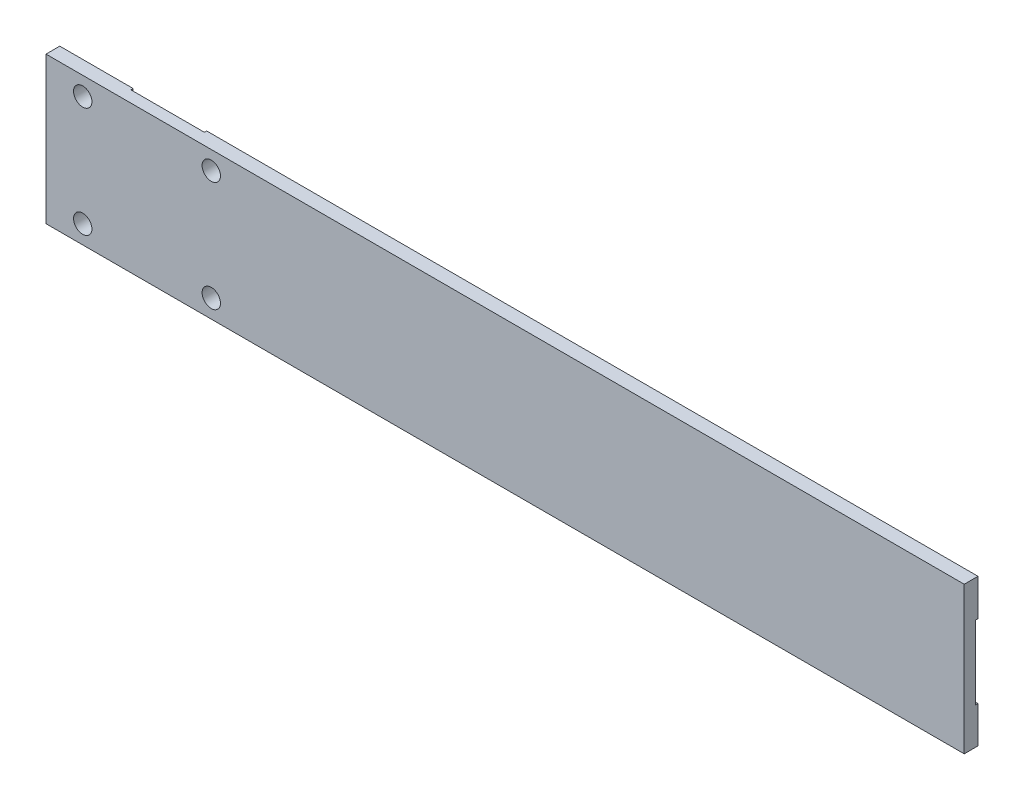
ISO-10303-21;
HEADER;
FILE_DESCRIPTION(('STEP AP214'),'2;1');
FILE_NAME('part.step','',(''),(''),'','','');
FILE_SCHEMA(('AUTOMOTIVE_DESIGN { 1 0 10303 214 1 1 1 1 }'));
ENDSEC;
DATA;
#1=APPLICATION_CONTEXT('core data for automotive mechanical design processes');
#2=APPLICATION_PROTOCOL_DEFINITION('international standard','automotive_design',2000,#1);
#3=PRODUCT_CONTEXT('',#1,'mechanical');
#4=PRODUCT('Part','Part','',(#3));
#5=PRODUCT_RELATED_PRODUCT_CATEGORY('part','',(#4));
#6=PRODUCT_DEFINITION_FORMATION('','',#4);
#7=PRODUCT_DEFINITION_CONTEXT('part definition',#1,'design');
#8=PRODUCT_DEFINITION('design','',#6,#7);
#9=PRODUCT_DEFINITION_SHAPE('','',#8);
#10=(LENGTH_UNIT() NAMED_UNIT(*) SI_UNIT(.MILLI.,.METRE.));
#11=(NAMED_UNIT(*) PLANE_ANGLE_UNIT() SI_UNIT($,.RADIAN.));
#12=(NAMED_UNIT(*) SI_UNIT($,.STERADIAN.) SOLID_ANGLE_UNIT());
#13=UNCERTAINTY_MEASURE_WITH_UNIT(LENGTH_MEASURE(1.E-05),#10,'distance_accuracy_value','');
#14=(GEOMETRIC_REPRESENTATION_CONTEXT(3) GLOBAL_UNCERTAINTY_ASSIGNED_CONTEXT((#13)) GLOBAL_UNIT_ASSIGNED_CONTEXT((#10,
#11,#12)) REPRESENTATION_CONTEXT('',''));
#15=CARTESIAN_POINT('',(0.,0.,0.));
#16=DIRECTION('',(0.,0.,1.));
#17=DIRECTION('',(1.,0.,0.));
#18=AXIS2_PLACEMENT_3D('',#15,#16,#17);
#19=CARTESIAN_POINT('',(0.,0.,0.));
#20=DIRECTION('',(0.,0.,-1.));
#21=DIRECTION('',(-1.,0.,0.));
#22=AXIS2_PLACEMENT_3D('',#19,#20,#21);
#23=PLANE('',#22);
#24=DIRECTION('',(0.,-1.,0.));
#25=VECTOR('',#24,1.);
#26=CARTESIAN_POINT('',(101.6,101.6,0.));
#27=LINE('',#26,#25);
#28=CARTESIAN_POINT('',(101.6,25.4,0.));
#29=VERTEX_POINT('',#28);
#30=CARTESIAN_POINT('',(101.6,0.,0.));
#31=VERTEX_POINT('',#30);
#32=EDGE_CURVE('E137',#29,#31,#27,.T.);
#33=ORIENTED_EDGE('',*,*,#32,.F.);
#34=DIRECTION('',(-1.,0.,0.));
#35=VECTOR('',#34,1.);
#36=CARTESIAN_POINT('',(635.,25.4,0.));
#37=LINE('',#36,#35);
#38=CARTESIAN_POINT('',(635.,25.4,0.));
#39=VERTEX_POINT('',#38);
#40=EDGE_CURVE('E237',#39,#29,#37,.T.);
#41=ORIENTED_EDGE('',*,*,#40,.F.);
#42=DIRECTION('',(0.,1.,0.));
#43=VECTOR('',#42,1.);
#44=CARTESIAN_POINT('',(635.,0.,0.));
#45=LINE('',#44,#43);
#46=CARTESIAN_POINT('',(635.,0.,0.));
#47=VERTEX_POINT('',#46);
#48=EDGE_CURVE('E160',#47,#39,#45,.T.);
#49=ORIENTED_EDGE('',*,*,#48,.F.);
#50=DIRECTION('',(1.,0.,0.));
#51=VECTOR('',#50,1.);
#52=CARTESIAN_POINT('',(0.,0.,0.));
#53=LINE('',#52,#51);
#54=EDGE_CURVE('E150',#31,#47,#53,.T.);
#55=ORIENTED_EDGE('',*,*,#54,.F.);
#56=EDGE_LOOP('',(#33,#41,#49,#55));
#57=FACE_BOUND('',#56,.T.);
#58=CARTESIAN_POINT('',(114.3,12.7,0.));
#59=DIRECTION('',(0.,0.,-1.));
#60=DIRECTION('',(1.,0.,0.));
#61=AXIS2_PLACEMENT_3D('',#58,#59,#60);
#62=CIRCLE('',#61,6.35);
#63=CARTESIAN_POINT('',(107.95,12.7,0.));
#64=VERTEX_POINT('',#63);
#65=EDGE_CURVE('E215',#64,#64,#62,.T.);
#66=ORIENTED_EDGE('',*,*,#65,.F.);
#67=EDGE_LOOP('',(#66));
#68=FACE_BOUND('',#67,.T.);
#69=ADVANCED_FACE('F38',(#57,#68),#23,.T.);
#70=CARTESIAN_POINT('',(101.6,101.6,0.));
#71=VERTEX_POINT('',#70);
#72=CARTESIAN_POINT('',(101.6,76.2,0.));
#73=VERTEX_POINT('',#72);
#74=EDGE_CURVE('E147',#71,#73,#27,.T.);
#75=ORIENTED_EDGE('',*,*,#74,.F.);
#76=DIRECTION('',(-1.,0.,0.));
#77=VECTOR('',#76,1.);
#78=CARTESIAN_POINT('',(0.,101.6,0.));
#79=LINE('',#78,#77);
#80=CARTESIAN_POINT('',(635.,101.6,0.));
#81=VERTEX_POINT('',#80);
#82=EDGE_CURVE('E172',#81,#71,#79,.T.);
#83=ORIENTED_EDGE('',*,*,#82,.F.);
#84=CARTESIAN_POINT('',(635.,76.2,0.));
#85=VERTEX_POINT('',#84);
#86=EDGE_CURVE('E165',#85,#81,#45,.T.);
#87=ORIENTED_EDGE('',*,*,#86,.F.);
#88=DIRECTION('',(-1.,0.,0.));
#89=VECTOR('',#88,1.);
#90=CARTESIAN_POINT('',(635.,76.2,0.));
#91=LINE('',#90,#89);
#92=EDGE_CURVE('E167',#85,#73,#91,.T.);
#93=ORIENTED_EDGE('',*,*,#92,.T.);
#94=EDGE_LOOP('',(#75,#83,#87,#93));
#95=FACE_BOUND('',#94,.T.);
#96=CARTESIAN_POINT('',(114.3,88.9,0.));
#97=DIRECTION('',(0.,0.,-1.));
#98=DIRECTION('',(-1.,0.,0.));
#99=AXIS2_PLACEMENT_3D('',#96,#97,#98);
#100=CIRCLE('',#99,6.34999999999999);
#101=CARTESIAN_POINT('',(107.95,88.9,0.));
#102=VERTEX_POINT('',#101);
#103=EDGE_CURVE('E208',#102,#102,#100,.T.);
#104=ORIENTED_EDGE('',*,*,#103,.F.);
#105=EDGE_LOOP('',(#104));
#106=FACE_BOUND('',#105,.T.);
#107=ADVANCED_FACE('F272',(#95,#106),#23,.T.);
#108=CARTESIAN_POINT('',(635.,0.,9.525));
#109=DIRECTION('',(-1.,0.,0.));
#110=DIRECTION('',(0.,0.,1.));
#111=AXIS2_PLACEMENT_3D('',#108,#109,#110);
#112=PLANE('',#111);
#113=DIRECTION('',(0.,0.,1.));
#114=VECTOR('',#113,1.);
#115=CARTESIAN_POINT('',(635.,76.2,0.));
#116=LINE('',#115,#114);
#117=CARTESIAN_POINT('',(635.,76.2,1.5875));
#118=VERTEX_POINT('',#117);
#119=EDGE_CURVE('E231',#85,#118,#116,.T.);
#120=ORIENTED_EDGE('',*,*,#119,.F.);
#121=ORIENTED_EDGE('',*,*,#86,.T.);
#122=DIRECTION('',(0.,0.,-1.));
#123=VECTOR('',#122,1.);
#124=CARTESIAN_POINT('',(635.,101.6,9.525));
#125=LINE('',#124,#123);
#126=CARTESIAN_POINT('',(635.,101.6,9.525));
#127=VERTEX_POINT('',#126);
#128=EDGE_CURVE('E178',#127,#81,#125,.T.);
#129=ORIENTED_EDGE('',*,*,#128,.F.);
#130=DIRECTION('',(0.,1.,0.));
#131=VECTOR('',#130,1.);
#132=CARTESIAN_POINT('',(635.,0.,9.525));
#133=LINE('',#132,#131);
#134=CARTESIAN_POINT('',(635.,0.,9.525));
#135=VERTEX_POINT('',#134);
#136=EDGE_CURVE('E249',#135,#127,#133,.T.);
#137=ORIENTED_EDGE('',*,*,#136,.F.);
#138=DIRECTION('',(0.,0.,-1.));
#139=VECTOR('',#138,1.);
#140=CARTESIAN_POINT('',(635.,0.,9.525));
#141=LINE('',#140,#139);
#142=EDGE_CURVE('E181',#135,#47,#141,.T.);
#143=ORIENTED_EDGE('',*,*,#142,.T.);
#144=ORIENTED_EDGE('',*,*,#48,.T.);
#145=DIRECTION('',(0.,0.,-1.));
#146=VECTOR('',#145,1.);
#147=CARTESIAN_POINT('',(635.,25.4,0.));
#148=LINE('',#147,#146);
#149=CARTESIAN_POINT('',(635.,25.4,1.58749999999999));
#150=VERTEX_POINT('',#149);
#151=EDGE_CURVE('E235',#150,#39,#148,.T.);
#152=ORIENTED_EDGE('',*,*,#151,.F.);
#153=DIRECTION('',(0.,-1.,0.));
#154=VECTOR('',#153,1.);
#155=CARTESIAN_POINT('',(635.,76.2,1.5875));
#156=LINE('',#155,#154);
#157=EDGE_CURVE('E233',#118,#150,#156,.T.);
#158=ORIENTED_EDGE('',*,*,#157,.F.);
#159=EDGE_LOOP('',(#120,#121,#129,#137,#143,#144,#152,#158));
#160=FACE_BOUND('',#159,.T.);
#161=ADVANCED_FACE('F255',(#160),#112,.F.);
#162=DIRECTION('',(0.,1.,0.));
#163=VECTOR('',#162,1.);
#164=CARTESIAN_POINT('',(50.8,76.2,0.));
#165=LINE('',#164,#163);
#166=CARTESIAN_POINT('',(50.8,0.,0.));
#167=VERTEX_POINT('',#166);
#168=CARTESIAN_POINT('',(50.8,101.6,0.));
#169=VERTEX_POINT('',#168);
#170=EDGE_CURVE('E189',#167,#169,#165,.T.);
#171=ORIENTED_EDGE('',*,*,#170,.F.);
#172=CARTESIAN_POINT('',(0.,0.,0.));
#173=VERTEX_POINT('',#172);
#174=EDGE_CURVE('E161',#173,#167,#53,.T.);
#175=ORIENTED_EDGE('',*,*,#174,.F.);
#176=DIRECTION('',(0.,-1.,0.));
#177=VECTOR('',#176,1.);
#178=CARTESIAN_POINT('',(0.,0.,0.));
#179=LINE('',#178,#177);
#180=CARTESIAN_POINT('',(0.,101.6,0.));
#181=VERTEX_POINT('',#180);
#182=EDGE_CURVE('E162',#181,#173,#179,.T.);
#183=ORIENTED_EDGE('',*,*,#182,.F.);
#184=EDGE_CURVE('E83',#169,#181,#79,.T.);
#185=ORIENTED_EDGE('',*,*,#184,.F.);
#186=EDGE_LOOP('',(#171,#175,#183,#185));
#187=FACE_BOUND('',#186,.T.);
#188=CARTESIAN_POINT('',(25.4,12.7,0.));
#189=DIRECTION('',(0.,0.,-1.));
#190=DIRECTION('',(1.,0.,0.));
#191=AXIS2_PLACEMENT_3D('',#188,#189,#190);
#192=CIRCLE('',#191,6.35);
#193=CARTESIAN_POINT('',(19.05,12.7,0.));
#194=VERTEX_POINT('',#193);
#195=EDGE_CURVE('E221',#194,#194,#192,.T.);
#196=ORIENTED_EDGE('',*,*,#195,.F.);
#197=EDGE_LOOP('',(#196));
#198=FACE_BOUND('',#197,.T.);
#199=CARTESIAN_POINT('',(25.4,88.9,0.));
#200=DIRECTION('',(0.,0.,-1.));
#201=DIRECTION('',(-1.,0.,0.));
#202=AXIS2_PLACEMENT_3D('',#199,#200,#201);
#203=CIRCLE('',#202,6.35);
#204=CARTESIAN_POINT('',(19.05,88.9,0.));
#205=VERTEX_POINT('',#204);
#206=EDGE_CURVE('E211',#205,#205,#203,.T.);
#207=ORIENTED_EDGE('',*,*,#206,.F.);
#208=EDGE_LOOP('',(#207));
#209=FACE_BOUND('',#208,.T.);
#210=ADVANCED_FACE('F187',(#187,#198,#209),#23,.T.);
#211=CARTESIAN_POINT('',(0.,0.,9.525));
#212=DIRECTION('',(1.,0.,0.));
#213=DIRECTION('',(0.,0.,-1.));
#214=AXIS2_PLACEMENT_3D('',#211,#212,#213);
#215=PLANE('',#214);
#216=ORIENTED_EDGE('',*,*,#182,.T.);
#217=DIRECTION('',(0.,0.,-1.));
#218=VECTOR('',#217,1.);
#219=CARTESIAN_POINT('',(0.,0.,9.525));
#220=LINE('',#219,#218);
#221=CARTESIAN_POINT('',(0.,0.,9.525));
#222=VERTEX_POINT('',#221);
#223=EDGE_CURVE('E46',#222,#173,#220,.T.);
#224=ORIENTED_EDGE('',*,*,#223,.F.);
#225=DIRECTION('',(0.,-1.,0.));
#226=VECTOR('',#225,1.);
#227=CARTESIAN_POINT('',(0.,0.,9.525));
#228=LINE('',#227,#226);
#229=CARTESIAN_POINT('',(0.,101.6,9.525));
#230=VERTEX_POINT('',#229);
#231=EDGE_CURVE('E175',#230,#222,#228,.T.);
#232=ORIENTED_EDGE('',*,*,#231,.F.);
#233=DIRECTION('',(0.,0.,-1.));
#234=VECTOR('',#233,1.);
#235=CARTESIAN_POINT('',(0.,101.6,9.525));
#236=LINE('',#235,#234);
#237=EDGE_CURVE('E176',#230,#181,#236,.T.);
#238=ORIENTED_EDGE('',*,*,#237,.T.);
#239=EDGE_LOOP('',(#216,#224,#232,#238));
#240=FACE_BOUND('',#239,.T.);
#241=ADVANCED_FACE('F40',(#240),#215,.F.);
#242=CARTESIAN_POINT('',(0.,0.,9.525));
#243=DIRECTION('',(0.,1.,0.));
#244=DIRECTION('',(0.,0.,1.));
#245=AXIS2_PLACEMENT_3D('',#242,#243,#244);
#246=PLANE('',#245);
#247=DIRECTION('',(1.,0.,0.));
#248=VECTOR('',#247,1.);
#249=CARTESIAN_POINT('',(101.6,0.,1.58749999999999));
#250=LINE('',#249,#248);
#251=CARTESIAN_POINT('',(50.8,0.,1.58749999999999));
#252=VERTEX_POINT('',#251);
#253=CARTESIAN_POINT('',(101.6,0.,1.58749999999999));
#254=VERTEX_POINT('',#253);
#255=EDGE_CURVE('E154',#252,#254,#250,.T.);
#256=ORIENTED_EDGE('',*,*,#255,.T.);
#257=DIRECTION('',(0.,0.,-1.));
#258=VECTOR('',#257,1.);
#259=CARTESIAN_POINT('',(101.6,0.,115.179753256989));
#260=LINE('',#259,#258);
#261=EDGE_CURVE('E140',#254,#31,#260,.T.);
#262=ORIENTED_EDGE('',*,*,#261,.T.);
#263=ORIENTED_EDGE('',*,*,#54,.T.);
#264=ORIENTED_EDGE('',*,*,#142,.F.);
#265=DIRECTION('',(1.,0.,0.));
#266=VECTOR('',#265,1.);
#267=CARTESIAN_POINT('',(0.,0.,9.525));
#268=LINE('',#267,#266);
#269=EDGE_CURVE('E91',#222,#135,#268,.T.);
#270=ORIENTED_EDGE('',*,*,#269,.F.);
#271=ORIENTED_EDGE('',*,*,#223,.T.);
#272=ORIENTED_EDGE('',*,*,#174,.T.);
#273=DIRECTION('',(0.,0.,-1.));
#274=VECTOR('',#273,1.);
#275=CARTESIAN_POINT('',(50.8,0.,115.179753256989));
#276=LINE('',#275,#274);
#277=EDGE_CURVE('E155',#252,#167,#276,.T.);
#278=ORIENTED_EDGE('',*,*,#277,.F.);
#279=EDGE_LOOP('',(#256,#262,#263,#264,#270,#271,#272,#278));
#280=FACE_BOUND('',#279,.T.);
#281=ADVANCED_FACE('F149',(#280),#246,.F.);
#282=CARTESIAN_POINT('',(0.,101.6,9.525));
#283=DIRECTION('',(0.,-1.,0.));
#284=DIRECTION('',(0.,0.,-1.));
#285=AXIS2_PLACEMENT_3D('',#282,#283,#284);
#286=PLANE('',#285);
#287=ORIENTED_EDGE('',*,*,#82,.T.);
#288=DIRECTION('',(0.,0.,-1.));
#289=VECTOR('',#288,1.);
#290=CARTESIAN_POINT('',(101.6,101.6,115.179753256989));
#291=LINE('',#290,#289);
#292=CARTESIAN_POINT('',(101.6,101.6,1.58750000000001));
#293=VERTEX_POINT('',#292);
#294=EDGE_CURVE('E199',#293,#71,#291,.T.);
#295=ORIENTED_EDGE('',*,*,#294,.F.);
#296=DIRECTION('',(-1.,0.,0.));
#297=VECTOR('',#296,1.);
#298=CARTESIAN_POINT('',(101.6,101.6,1.58750000000001));
#299=LINE('',#298,#297);
#300=CARTESIAN_POINT('',(50.8,101.6,1.58750000000001));
#301=VERTEX_POINT('',#300);
#302=EDGE_CURVE('E482',#293,#301,#299,.T.);
#303=ORIENTED_EDGE('',*,*,#302,.T.);
#304=DIRECTION('',(0.,0.,-1.));
#305=VECTOR('',#304,1.);
#306=CARTESIAN_POINT('',(50.8,101.6,115.179753256989));
#307=LINE('',#306,#305);
#308=EDGE_CURVE('E197',#301,#169,#307,.T.);
#309=ORIENTED_EDGE('',*,*,#308,.T.);
#310=ORIENTED_EDGE('',*,*,#184,.T.);
#311=ORIENTED_EDGE('',*,*,#237,.F.);
#312=DIRECTION('',(-1.,0.,0.));
#313=VECTOR('',#312,1.);
#314=CARTESIAN_POINT('',(0.,101.6,9.525));
#315=LINE('',#314,#313);
#316=EDGE_CURVE('E62',#127,#230,#315,.T.);
#317=ORIENTED_EDGE('',*,*,#316,.F.);
#318=ORIENTED_EDGE('',*,*,#128,.T.);
#319=EDGE_LOOP('',(#287,#295,#303,#309,#310,#311,#317,#318));
#320=FACE_BOUND('',#319,.T.);
#321=ADVANCED_FACE('F258',(#320),#286,.F.);
#322=CARTESIAN_POINT('',(0.,0.,9.525));
#323=DIRECTION('',(0.,0.,-1.));
#324=DIRECTION('',(-1.,0.,0.));
#325=AXIS2_PLACEMENT_3D('',#322,#323,#324);
#326=PLANE('',#325);
#327=CARTESIAN_POINT('',(25.4,12.7,9.525));
#328=DIRECTION('',(0.,0.,-1.));
#329=DIRECTION('',(1.,0.,0.));
#330=AXIS2_PLACEMENT_3D('',#327,#328,#329);
#331=CIRCLE('',#330,6.35);
#332=CARTESIAN_POINT('',(19.05,12.7,9.525));
#333=VERTEX_POINT('',#332);
#334=EDGE_CURVE('E207',#333,#333,#331,.T.);
#335=ORIENTED_EDGE('',*,*,#334,.T.);
#336=EDGE_LOOP('',(#335));
#337=FACE_BOUND('',#336,.T.);
#338=CARTESIAN_POINT('',(114.3,12.7,9.525));
#339=DIRECTION('',(0.,0.,-1.));
#340=DIRECTION('',(1.,0.,0.));
#341=AXIS2_PLACEMENT_3D('',#338,#339,#340);
#342=CIRCLE('',#341,6.35);
#343=CARTESIAN_POINT('',(107.95,12.7,9.525));
#344=VERTEX_POINT('',#343);
#345=EDGE_CURVE('E218',#344,#344,#342,.T.);
#346=ORIENTED_EDGE('',*,*,#345,.T.);
#347=EDGE_LOOP('',(#346));
#348=FACE_BOUND('',#347,.T.);
#349=CARTESIAN_POINT('',(114.3,88.9,9.525));
#350=DIRECTION('',(0.,0.,-1.));
#351=DIRECTION('',(-1.,0.,0.));
#352=AXIS2_PLACEMENT_3D('',#349,#350,#351);
#353=CIRCLE('',#352,6.34999999999999);
#354=CARTESIAN_POINT('',(107.95,88.9,9.525));
#355=VERTEX_POINT('',#354);
#356=EDGE_CURVE('E212',#355,#355,#353,.T.);
#357=ORIENTED_EDGE('',*,*,#356,.T.);
#358=EDGE_LOOP('',(#357));
#359=FACE_BOUND('',#358,.T.);
#360=CARTESIAN_POINT('',(25.4,88.9,9.525));
#361=DIRECTION('',(0.,0.,-1.));
#362=DIRECTION('',(-1.,0.,0.));
#363=AXIS2_PLACEMENT_3D('',#360,#361,#362);
#364=CIRCLE('',#363,6.35);
#365=CARTESIAN_POINT('',(19.05,88.9,9.525));
#366=VERTEX_POINT('',#365);
#367=EDGE_CURVE('E194',#366,#366,#364,.T.);
#368=ORIENTED_EDGE('',*,*,#367,.T.);
#369=EDGE_LOOP('',(#368));
#370=FACE_BOUND('',#369,.T.);
#371=ORIENTED_EDGE('',*,*,#231,.T.);
#372=ORIENTED_EDGE('',*,*,#269,.T.);
#373=ORIENTED_EDGE('',*,*,#136,.T.);
#374=ORIENTED_EDGE('',*,*,#316,.T.);
#375=EDGE_LOOP('',(#371,#372,#373,#374));
#376=FACE_BOUND('',#375,.T.);
#377=ADVANCED_FACE('F252',(#337,#348,#359,#370,#376),#326,.F.);
#378=CARTESIAN_POINT('',(635.,76.2,0.));
#379=DIRECTION('',(0.,-1.,0.));
#380=DIRECTION('',(0.,0.,-1.));
#381=AXIS2_PLACEMENT_3D('',#378,#379,#380);
#382=PLANE('',#381);
#383=DIRECTION('',(0.,0.,1.));
#384=VECTOR('',#383,1.);
#385=CARTESIAN_POINT('',(101.6,76.2,0.));
#386=LINE('',#385,#384);
#387=CARTESIAN_POINT('',(101.6,76.2,1.5875));
#388=VERTEX_POINT('',#387);
#389=EDGE_CURVE('E204',#73,#388,#386,.T.);
#390=ORIENTED_EDGE('',*,*,#389,.F.);
#391=ORIENTED_EDGE('',*,*,#92,.F.);
#392=ORIENTED_EDGE('',*,*,#119,.T.);
#393=DIRECTION('',(-1.,0.,0.));
#394=VECTOR('',#393,1.);
#395=CARTESIAN_POINT('',(635.,76.2,1.5875));
#396=LINE('',#395,#394);
#397=EDGE_CURVE('E242',#118,#388,#396,.T.);
#398=ORIENTED_EDGE('',*,*,#397,.T.);
#399=EDGE_LOOP('',(#390,#391,#392,#398));
#400=FACE_BOUND('',#399,.T.);
#401=ADVANCED_FACE('F266',(#400),#382,.T.);
#402=CARTESIAN_POINT('',(635.,76.2,1.5875));
#403=DIRECTION('',(0.,0.,-1.));
#404=DIRECTION('',(0.,1.,0.));
#405=AXIS2_PLACEMENT_3D('',#402,#403,#404);
#406=PLANE('',#405);
#407=DIRECTION('',(-1.,0.,0.));
#408=VECTOR('',#407,1.);
#409=CARTESIAN_POINT('',(635.,25.4,1.58749999999999));
#410=LINE('',#409,#408);
#411=CARTESIAN_POINT('',(101.6,25.4,1.5875));
#412=VERTEX_POINT('',#411);
#413=EDGE_CURVE('E239',#150,#412,#410,.T.);
#414=ORIENTED_EDGE('',*,*,#413,.T.);
#415=DIRECTION('',(0.,1.,0.));
#416=VECTOR('',#415,1.);
#417=CARTESIAN_POINT('',(101.6,101.6,1.58750000000001));
#418=LINE('',#417,#416);
#419=EDGE_CURVE('E205',#254,#412,#418,.T.);
#420=ORIENTED_EDGE('',*,*,#419,.F.);
#421=ORIENTED_EDGE('',*,*,#255,.F.);
#422=DIRECTION('',(0.,-1.,0.));
#423=VECTOR('',#422,1.);
#424=CARTESIAN_POINT('',(50.8,76.2,1.5875));
#425=LINE('',#424,#423);
#426=EDGE_CURVE('E193',#301,#252,#425,.T.);
#427=ORIENTED_EDGE('',*,*,#426,.F.);
#428=ORIENTED_EDGE('',*,*,#302,.F.);
#429=EDGE_CURVE('E53',#388,#293,#418,.T.);
#430=ORIENTED_EDGE('',*,*,#429,.F.);
#431=ORIENTED_EDGE('',*,*,#397,.F.);
#432=ORIENTED_EDGE('',*,*,#157,.T.);
#433=EDGE_LOOP('',(#414,#420,#421,#427,#428,#430,#431,#432));
#434=FACE_BOUND('',#433,.T.);
#435=ADVANCED_FACE('F323',(#434),#406,.T.);
#436=CARTESIAN_POINT('',(635.,25.4,0.));
#437=DIRECTION('',(0.,1.,0.));
#438=DIRECTION('',(0.,0.,1.));
#439=AXIS2_PLACEMENT_3D('',#436,#437,#438);
#440=PLANE('',#439);
#441=DIRECTION('',(0.,0.,-1.));
#442=VECTOR('',#441,1.);
#443=CARTESIAN_POINT('',(101.6,25.4,0.));
#444=LINE('',#443,#442);
#445=EDGE_CURVE('E11',#412,#29,#444,.T.);
#446=ORIENTED_EDGE('',*,*,#445,.F.);
#447=ORIENTED_EDGE('',*,*,#413,.F.);
#448=ORIENTED_EDGE('',*,*,#151,.T.);
#449=ORIENTED_EDGE('',*,*,#40,.T.);
#450=EDGE_LOOP('',(#446,#447,#448,#449));
#451=FACE_BOUND('',#450,.T.);
#452=ADVANCED_FACE('F336',(#451),#440,.T.);
#453=CARTESIAN_POINT('',(50.8,0.,0.));
#454=DIRECTION('',(-1.,0.,0.));
#455=DIRECTION('',(0.,0.,1.));
#456=AXIS2_PLACEMENT_3D('',#453,#454,#455);
#457=PLANE('',#456);
#458=ORIENTED_EDGE('',*,*,#170,.T.);
#459=ORIENTED_EDGE('',*,*,#308,.F.);
#460=ORIENTED_EDGE('',*,*,#426,.T.);
#461=ORIENTED_EDGE('',*,*,#277,.T.);
#462=EDGE_LOOP('',(#458,#459,#460,#461));
#463=FACE_BOUND('',#462,.T.);
#464=ADVANCED_FACE('F196',(#463),#457,.F.);
#465=CARTESIAN_POINT('',(25.4,88.9,9.525));
#466=DIRECTION('',(0.,0.,-1.));
#467=DIRECTION('',(-1.,0.,0.));
#468=AXIS2_PLACEMENT_3D('',#465,#466,#467);
#469=CYLINDRICAL_SURFACE('',#468,6.35);
#470=CARTESIAN_POINT('',(19.05,88.9,9.525));
#471=CARTESIAN_POINT('',(19.05,88.9,9.42578125));
#472=CARTESIAN_POINT('',(19.05,88.9,9.3265625));
#473=CARTESIAN_POINT('',(19.05,88.9,9.128125));
#474=CARTESIAN_POINT('',(19.05,88.9,9.02890625));
#475=CARTESIAN_POINT('',(19.05,88.9,8.83046875));
#476=CARTESIAN_POINT('',(19.05,88.9,8.73125));
#477=CARTESIAN_POINT('',(19.05,88.9,8.5328125));
#478=CARTESIAN_POINT('',(19.05,88.9,8.43359375));
#479=CARTESIAN_POINT('',(19.05,88.9,8.23515625));
#480=CARTESIAN_POINT('',(19.05,88.9,8.1359375));
#481=CARTESIAN_POINT('',(19.05,88.9,7.9375));
#482=CARTESIAN_POINT('',(19.05,88.9,7.83828125));
#483=CARTESIAN_POINT('',(19.05,88.9,7.63984375));
#484=CARTESIAN_POINT('',(19.05,88.9,7.540625));
#485=CARTESIAN_POINT('',(19.05,88.9,7.3421875));
#486=CARTESIAN_POINT('',(19.05,88.9,7.24296875));
#487=CARTESIAN_POINT('',(19.05,88.9,7.04453125));
#488=CARTESIAN_POINT('',(19.05,88.9,6.9453125));
#489=CARTESIAN_POINT('',(19.05,88.9,6.746875));
#490=CARTESIAN_POINT('',(19.05,88.9,6.64765625));
#491=CARTESIAN_POINT('',(19.05,88.9,6.44921875));
#492=CARTESIAN_POINT('',(19.05,88.9,6.35));
#493=CARTESIAN_POINT('',(19.05,88.9,6.1515625));
#494=CARTESIAN_POINT('',(19.05,88.9,6.05234375));
#495=CARTESIAN_POINT('',(19.05,88.9,5.85390625));
#496=CARTESIAN_POINT('',(19.05,88.9,5.7546875));
#497=CARTESIAN_POINT('',(19.05,88.9,5.55625));
#498=CARTESIAN_POINT('',(19.05,88.9,5.45703125));
#499=CARTESIAN_POINT('',(19.05,88.9,5.25859375));
#500=CARTESIAN_POINT('',(19.05,88.9,5.159375));
#501=CARTESIAN_POINT('',(19.05,88.9,4.9609375));
#502=CARTESIAN_POINT('',(19.05,88.9,4.86171875));
#503=CARTESIAN_POINT('',(19.05,88.9,4.66328125));
#504=CARTESIAN_POINT('',(19.05,88.9,4.5640625));
#505=CARTESIAN_POINT('',(19.05,88.9,4.365625));
#506=CARTESIAN_POINT('',(19.05,88.9,4.26640625));
#507=CARTESIAN_POINT('',(19.05,88.9,4.06796875));
#508=CARTESIAN_POINT('',(19.05,88.9,3.96875));
#509=CARTESIAN_POINT('',(19.05,88.9,3.7703125));
#510=CARTESIAN_POINT('',(19.05,88.9,3.67109375));
#511=CARTESIAN_POINT('',(19.05,88.9,3.47265625));
#512=CARTESIAN_POINT('',(19.05,88.9,3.3734375));
#513=CARTESIAN_POINT('',(19.05,88.9,3.175));
#514=CARTESIAN_POINT('',(19.05,88.9,3.07578125));
#515=CARTESIAN_POINT('',(19.05,88.9,2.87734375));
#516=CARTESIAN_POINT('',(19.05,88.9,2.778125));
#517=CARTESIAN_POINT('',(19.05,88.9,2.5796875));
#518=CARTESIAN_POINT('',(19.05,88.9,2.48046875));
#519=CARTESIAN_POINT('',(19.05,88.9,2.28203125));
#520=CARTESIAN_POINT('',(19.05,88.9,2.1828125));
#521=CARTESIAN_POINT('',(19.05,88.9,1.984375));
#522=CARTESIAN_POINT('',(19.05,88.9,1.88515625));
#523=CARTESIAN_POINT('',(19.05,88.9,1.68671875));
#524=CARTESIAN_POINT('',(19.05,88.9,1.5875));
#525=CARTESIAN_POINT('',(19.05,88.9,1.3890625));
#526=CARTESIAN_POINT('',(19.05,88.9,1.28984375));
#527=CARTESIAN_POINT('',(19.05,88.9,1.09140625));
#528=CARTESIAN_POINT('',(19.05,88.9,0.992187500000001));
#529=CARTESIAN_POINT('',(19.05,88.9,0.793750000000001));
#530=CARTESIAN_POINT('',(19.05,88.9,0.69453125));
#531=CARTESIAN_POINT('',(19.05,88.9,0.49609375));
#532=CARTESIAN_POINT('',(19.05,88.9,0.396875));
#533=CARTESIAN_POINT('',(19.05,88.9,0.1984375));
#534=CARTESIAN_POINT('',(19.05,88.9,0.0992187500000001));
#535=CARTESIAN_POINT('',(19.05,88.9,0.));
#536=B_SPLINE_CURVE_WITH_KNOTS('',3,(#470,#471,#472,#473,#474,#475,#476,#477,#478,#479,#480,
#481,#482,#483,#484,#485,#486,#487,#488,#489,#490,#491,#492,#493,#494,#495,#496,#497,#498,#499,
#500,#501,#502,#503,#504,#505,#506,#507,#508,#509,#510,#511,#512,#513,#514,#515,#516,#517,#518,
#519,#520,#521,#522,#523,#524,#525,#526,#527,#528,#529,#530,#531,#532,#533,#534,#535),
.UNSPECIFIED.,.F.,.F.,(4,2,2,2,2,2,2,2,2,2,2,2,2,2,2,2,2,2,2,2,2,2,2,2,2,2,2,2,2,2,2,2,4),(0.,
0.29765625,0.5953125,0.892968750000001,1.190625,1.48828125,1.7859375,2.08359375,2.38125,
2.67890625,2.9765625,3.27421875,3.571875,3.86953125,4.1671875,4.46484375,4.7625,5.06015625,
5.3578125,5.65546875,5.953125,6.25078125,6.5484375,6.84609375,7.14375,7.44140625,7.7390625,
8.03671875,8.334375,8.63203125,8.9296875,9.22734375,9.525),.UNSPECIFIED.);
#537=EDGE_CURVE('BSEAM356',#366,#205,#536,.T.);
#538=ORIENTED_EDGE('',*,*,#367,.F.);
#539=ORIENTED_EDGE('',*,*,#206,.T.);
#540=ORIENTED_EDGE('',*,*,#537,.T.);
#541=ORIENTED_EDGE('',*,*,#537,.F.);
#542=EDGE_LOOP('',(#538,#540,#539,#541));
#543=FACE_BOUND('',#542,.T.);
#544=ADVANCED_FACE('F356',(#543),#469,.F.);
#545=CARTESIAN_POINT('',(114.3,88.9,9.525));
#546=DIRECTION('',(0.,0.,-1.));
#547=DIRECTION('',(-1.,0.,0.));
#548=AXIS2_PLACEMENT_3D('',#545,#546,#547);
#549=CYLINDRICAL_SURFACE('',#548,6.34999999999999);
#550=CARTESIAN_POINT('',(107.95,88.9,9.525));
#551=CARTESIAN_POINT('',(107.95,88.9,9.42578125));
#552=CARTESIAN_POINT('',(107.95,88.9,9.3265625));
#553=CARTESIAN_POINT('',(107.95,88.9,9.128125));
#554=CARTESIAN_POINT('',(107.95,88.9,9.02890625));
#555=CARTESIAN_POINT('',(107.95,88.9,8.83046875));
#556=CARTESIAN_POINT('',(107.95,88.9,8.73125));
#557=CARTESIAN_POINT('',(107.95,88.9,8.5328125));
#558=CARTESIAN_POINT('',(107.95,88.9,8.43359375));
#559=CARTESIAN_POINT('',(107.95,88.9,8.23515625));
#560=CARTESIAN_POINT('',(107.95,88.9,8.1359375));
#561=CARTESIAN_POINT('',(107.95,88.9,7.9375));
#562=CARTESIAN_POINT('',(107.95,88.9,7.83828125));
#563=CARTESIAN_POINT('',(107.95,88.9,7.63984375));
#564=CARTESIAN_POINT('',(107.95,88.9,7.540625));
#565=CARTESIAN_POINT('',(107.95,88.9,7.3421875));
#566=CARTESIAN_POINT('',(107.95,88.9,7.24296875));
#567=CARTESIAN_POINT('',(107.95,88.9,7.04453125));
#568=CARTESIAN_POINT('',(107.95,88.9,6.9453125));
#569=CARTESIAN_POINT('',(107.95,88.9,6.746875));
#570=CARTESIAN_POINT('',(107.95,88.9,6.64765625));
#571=CARTESIAN_POINT('',(107.95,88.9,6.44921875));
#572=CARTESIAN_POINT('',(107.95,88.9,6.35));
#573=CARTESIAN_POINT('',(107.95,88.9,6.1515625));
#574=CARTESIAN_POINT('',(107.95,88.9,6.05234375));
#575=CARTESIAN_POINT('',(107.95,88.9,5.85390625));
#576=CARTESIAN_POINT('',(107.95,88.9,5.7546875));
#577=CARTESIAN_POINT('',(107.95,88.9,5.55625));
#578=CARTESIAN_POINT('',(107.95,88.9,5.45703125));
#579=CARTESIAN_POINT('',(107.95,88.9,5.25859375));
#580=CARTESIAN_POINT('',(107.95,88.9,5.159375));
#581=CARTESIAN_POINT('',(107.95,88.9,4.9609375));
#582=CARTESIAN_POINT('',(107.95,88.9,4.86171875));
#583=CARTESIAN_POINT('',(107.95,88.9,4.66328125));
#584=CARTESIAN_POINT('',(107.95,88.9,4.5640625));
#585=CARTESIAN_POINT('',(107.95,88.9,4.365625));
#586=CARTESIAN_POINT('',(107.95,88.9,4.26640625));
#587=CARTESIAN_POINT('',(107.95,88.9,4.06796875));
#588=CARTESIAN_POINT('',(107.95,88.9,3.96875));
#589=CARTESIAN_POINT('',(107.95,88.9,3.7703125));
#590=CARTESIAN_POINT('',(107.95,88.9,3.67109375));
#591=CARTESIAN_POINT('',(107.95,88.9,3.47265625));
#592=CARTESIAN_POINT('',(107.95,88.9,3.3734375));
#593=CARTESIAN_POINT('',(107.95,88.9,3.175));
#594=CARTESIAN_POINT('',(107.95,88.9,3.07578125));
#595=CARTESIAN_POINT('',(107.95,88.9,2.87734375));
#596=CARTESIAN_POINT('',(107.95,88.9,2.778125));
#597=CARTESIAN_POINT('',(107.95,88.9,2.5796875));
#598=CARTESIAN_POINT('',(107.95,88.9,2.48046875));
#599=CARTESIAN_POINT('',(107.95,88.9,2.28203125));
#600=CARTESIAN_POINT('',(107.95,88.9,2.1828125));
#601=CARTESIAN_POINT('',(107.95,88.9,1.984375));
#602=CARTESIAN_POINT('',(107.95,88.9,1.88515625));
#603=CARTESIAN_POINT('',(107.95,88.9,1.68671875));
#604=CARTESIAN_POINT('',(107.95,88.9,1.5875));
#605=CARTESIAN_POINT('',(107.95,88.9,1.3890625));
#606=CARTESIAN_POINT('',(107.95,88.9,1.28984375));
#607=CARTESIAN_POINT('',(107.95,88.9,1.09140625));
#608=CARTESIAN_POINT('',(107.95,88.9,0.992187500000001));
#609=CARTESIAN_POINT('',(107.95,88.9,0.793750000000001));
#610=CARTESIAN_POINT('',(107.95,88.9,0.69453125));
#611=CARTESIAN_POINT('',(107.95,88.9,0.49609375));
#612=CARTESIAN_POINT('',(107.95,88.9,0.396875));
#613=CARTESIAN_POINT('',(107.95,88.9,0.1984375));
#614=CARTESIAN_POINT('',(107.95,88.9,0.0992187500000001));
#615=CARTESIAN_POINT('',(107.95,88.9,0.));
#616=B_SPLINE_CURVE_WITH_KNOTS('',3,(#550,#551,#552,#553,#554,#555,#556,#557,#558,#559,#560,
#561,#562,#563,#564,#565,#566,#567,#568,#569,#570,#571,#572,#573,#574,#575,#576,#577,#578,#579,
#580,#581,#582,#583,#584,#585,#586,#587,#588,#589,#590,#591,#592,#593,#594,#595,#596,#597,#598,
#599,#600,#601,#602,#603,#604,#605,#606,#607,#608,#609,#610,#611,#612,#613,#614,#615),
.UNSPECIFIED.,.F.,.F.,(4,2,2,2,2,2,2,2,2,2,2,2,2,2,2,2,2,2,2,2,2,2,2,2,2,2,2,2,2,2,2,2,4),(0.,
0.29765625,0.5953125,0.892968750000001,1.190625,1.48828125,1.7859375,2.08359375,2.38125,
2.67890625,2.9765625,3.27421875,3.571875,3.86953125,4.1671875,4.46484375,4.7625,5.06015625,
5.3578125,5.65546875,5.953125,6.25078125,6.5484375,6.84609375,7.14375,7.44140625,7.7390625,
8.03671875,8.334375,8.63203125,8.9296875,9.22734375,9.525),.UNSPECIFIED.);
#617=EDGE_CURVE('BSEAM401',#355,#102,#616,.T.);
#618=ORIENTED_EDGE('',*,*,#356,.F.);
#619=ORIENTED_EDGE('',*,*,#103,.T.);
#620=ORIENTED_EDGE('',*,*,#617,.T.);
#621=ORIENTED_EDGE('',*,*,#617,.F.);
#622=EDGE_LOOP('',(#618,#620,#619,#621));
#623=FACE_BOUND('',#622,.T.);
#624=ADVANCED_FACE('F401',(#623),#549,.F.);
#625=CARTESIAN_POINT('',(114.3,12.7,9.525));
#626=DIRECTION('',(0.,0.,-1.));
#627=DIRECTION('',(-1.,0.,0.));
#628=AXIS2_PLACEMENT_3D('',#625,#626,#627);
#629=CYLINDRICAL_SURFACE('',#628,6.35);
#630=CARTESIAN_POINT('',(107.95,12.7,9.525));
#631=CARTESIAN_POINT('',(107.95,12.7,9.42578125));
#632=CARTESIAN_POINT('',(107.95,12.7,9.3265625));
#633=CARTESIAN_POINT('',(107.95,12.7,9.128125));
#634=CARTESIAN_POINT('',(107.95,12.7,9.02890625));
#635=CARTESIAN_POINT('',(107.95,12.7,8.83046875));
#636=CARTESIAN_POINT('',(107.95,12.7,8.73125));
#637=CARTESIAN_POINT('',(107.95,12.7,8.5328125));
#638=CARTESIAN_POINT('',(107.95,12.7,8.43359375));
#639=CARTESIAN_POINT('',(107.95,12.7,8.23515625));
#640=CARTESIAN_POINT('',(107.95,12.7,8.1359375));
#641=CARTESIAN_POINT('',(107.95,12.7,7.9375));
#642=CARTESIAN_POINT('',(107.95,12.7,7.83828125));
#643=CARTESIAN_POINT('',(107.95,12.7,7.63984375));
#644=CARTESIAN_POINT('',(107.95,12.7,7.540625));
#645=CARTESIAN_POINT('',(107.95,12.7,7.3421875));
#646=CARTESIAN_POINT('',(107.95,12.7,7.24296875));
#647=CARTESIAN_POINT('',(107.95,12.7,7.04453125));
#648=CARTESIAN_POINT('',(107.95,12.7,6.9453125));
#649=CARTESIAN_POINT('',(107.95,12.7,6.746875));
#650=CARTESIAN_POINT('',(107.95,12.7,6.64765625));
#651=CARTESIAN_POINT('',(107.95,12.7,6.44921875));
#652=CARTESIAN_POINT('',(107.95,12.7,6.35));
#653=CARTESIAN_POINT('',(107.95,12.7,6.1515625));
#654=CARTESIAN_POINT('',(107.95,12.7,6.05234375));
#655=CARTESIAN_POINT('',(107.95,12.7,5.85390625));
#656=CARTESIAN_POINT('',(107.95,12.7,5.7546875));
#657=CARTESIAN_POINT('',(107.95,12.7,5.55625));
#658=CARTESIAN_POINT('',(107.95,12.7,5.45703125));
#659=CARTESIAN_POINT('',(107.95,12.7,5.25859375));
#660=CARTESIAN_POINT('',(107.95,12.7,5.159375));
#661=CARTESIAN_POINT('',(107.95,12.7,4.9609375));
#662=CARTESIAN_POINT('',(107.95,12.7,4.86171875));
#663=CARTESIAN_POINT('',(107.95,12.7,4.66328125));
#664=CARTESIAN_POINT('',(107.95,12.7,4.5640625));
#665=CARTESIAN_POINT('',(107.95,12.7,4.365625));
#666=CARTESIAN_POINT('',(107.95,12.7,4.26640625));
#667=CARTESIAN_POINT('',(107.95,12.7,4.06796875));
#668=CARTESIAN_POINT('',(107.95,12.7,3.96875));
#669=CARTESIAN_POINT('',(107.95,12.7,3.7703125));
#670=CARTESIAN_POINT('',(107.95,12.7,3.67109375));
#671=CARTESIAN_POINT('',(107.95,12.7,3.47265625));
#672=CARTESIAN_POINT('',(107.95,12.7,3.3734375));
#673=CARTESIAN_POINT('',(107.95,12.7,3.175));
#674=CARTESIAN_POINT('',(107.95,12.7,3.07578125));
#675=CARTESIAN_POINT('',(107.95,12.7,2.87734375));
#676=CARTESIAN_POINT('',(107.95,12.7,2.778125));
#677=CARTESIAN_POINT('',(107.95,12.7,2.5796875));
#678=CARTESIAN_POINT('',(107.95,12.7,2.48046875));
#679=CARTESIAN_POINT('',(107.95,12.7,2.28203125));
#680=CARTESIAN_POINT('',(107.95,12.7,2.1828125));
#681=CARTESIAN_POINT('',(107.95,12.7,1.984375));
#682=CARTESIAN_POINT('',(107.95,12.7,1.88515625));
#683=CARTESIAN_POINT('',(107.95,12.7,1.68671875));
#684=CARTESIAN_POINT('',(107.95,12.7,1.5875));
#685=CARTESIAN_POINT('',(107.95,12.7,1.3890625));
#686=CARTESIAN_POINT('',(107.95,12.7,1.28984375));
#687=CARTESIAN_POINT('',(107.95,12.7,1.09140625));
#688=CARTESIAN_POINT('',(107.95,12.7,0.992187500000001));
#689=CARTESIAN_POINT('',(107.95,12.7,0.793750000000001));
#690=CARTESIAN_POINT('',(107.95,12.7,0.69453125));
#691=CARTESIAN_POINT('',(107.95,12.7,0.49609375));
#692=CARTESIAN_POINT('',(107.95,12.7,0.396875));
#693=CARTESIAN_POINT('',(107.95,12.7,0.1984375));
#694=CARTESIAN_POINT('',(107.95,12.7,0.0992187500000001));
#695=CARTESIAN_POINT('',(107.95,12.7,0.));
#696=B_SPLINE_CURVE_WITH_KNOTS('',3,(#630,#631,#632,#633,#634,#635,#636,#637,#638,#639,#640,
#641,#642,#643,#644,#645,#646,#647,#648,#649,#650,#651,#652,#653,#654,#655,#656,#657,#658,#659,
#660,#661,#662,#663,#664,#665,#666,#667,#668,#669,#670,#671,#672,#673,#674,#675,#676,#677,#678,
#679,#680,#681,#682,#683,#684,#685,#686,#687,#688,#689,#690,#691,#692,#693,#694,#695),
.UNSPECIFIED.,.F.,.F.,(4,2,2,2,2,2,2,2,2,2,2,2,2,2,2,2,2,2,2,2,2,2,2,2,2,2,2,2,2,2,2,2,4),(0.,
0.29765625,0.5953125,0.892968750000001,1.190625,1.48828125,1.7859375,2.08359375,2.38125,
2.67890625,2.9765625,3.27421875,3.571875,3.86953125,4.1671875,4.46484375,4.7625,5.06015625,
5.3578125,5.65546875,5.953125,6.25078125,6.5484375,6.84609375,7.14375,7.44140625,7.7390625,
8.03671875,8.334375,8.63203125,8.9296875,9.22734375,9.525),.UNSPECIFIED.);
#697=EDGE_CURVE('BSEAM392',#344,#64,#696,.T.);
#698=ORIENTED_EDGE('',*,*,#345,.F.);
#699=ORIENTED_EDGE('',*,*,#65,.T.);
#700=ORIENTED_EDGE('',*,*,#697,.T.);
#701=ORIENTED_EDGE('',*,*,#697,.F.);
#702=EDGE_LOOP('',(#698,#700,#699,#701));
#703=FACE_BOUND('',#702,.T.);
#704=ADVANCED_FACE('F392',(#703),#629,.F.);
#705=CARTESIAN_POINT('',(25.4,12.7,9.525));
#706=DIRECTION('',(0.,0.,-1.));
#707=DIRECTION('',(-1.,0.,0.));
#708=AXIS2_PLACEMENT_3D('',#705,#706,#707);
#709=CYLINDRICAL_SURFACE('',#708,6.35);
#710=CARTESIAN_POINT('',(19.05,12.7,9.525));
#711=CARTESIAN_POINT('',(19.05,12.7,9.42578125));
#712=CARTESIAN_POINT('',(19.05,12.7,9.3265625));
#713=CARTESIAN_POINT('',(19.05,12.7,9.128125));
#714=CARTESIAN_POINT('',(19.05,12.7,9.02890625));
#715=CARTESIAN_POINT('',(19.05,12.7,8.83046875));
#716=CARTESIAN_POINT('',(19.05,12.7,8.73125));
#717=CARTESIAN_POINT('',(19.05,12.7,8.5328125));
#718=CARTESIAN_POINT('',(19.05,12.7,8.43359375));
#719=CARTESIAN_POINT('',(19.05,12.7,8.23515625));
#720=CARTESIAN_POINT('',(19.05,12.7,8.1359375));
#721=CARTESIAN_POINT('',(19.05,12.7,7.9375));
#722=CARTESIAN_POINT('',(19.05,12.7,7.83828125));
#723=CARTESIAN_POINT('',(19.05,12.7,7.63984375));
#724=CARTESIAN_POINT('',(19.05,12.7,7.540625));
#725=CARTESIAN_POINT('',(19.05,12.7,7.3421875));
#726=CARTESIAN_POINT('',(19.05,12.7,7.24296875));
#727=CARTESIAN_POINT('',(19.05,12.7,7.04453125));
#728=CARTESIAN_POINT('',(19.05,12.7,6.9453125));
#729=CARTESIAN_POINT('',(19.05,12.7,6.746875));
#730=CARTESIAN_POINT('',(19.05,12.7,6.64765625));
#731=CARTESIAN_POINT('',(19.05,12.7,6.44921875));
#732=CARTESIAN_POINT('',(19.05,12.7,6.35));
#733=CARTESIAN_POINT('',(19.05,12.7,6.1515625));
#734=CARTESIAN_POINT('',(19.05,12.7,6.05234375));
#735=CARTESIAN_POINT('',(19.05,12.7,5.85390625));
#736=CARTESIAN_POINT('',(19.05,12.7,5.7546875));
#737=CARTESIAN_POINT('',(19.05,12.7,5.55625));
#738=CARTESIAN_POINT('',(19.05,12.7,5.45703125));
#739=CARTESIAN_POINT('',(19.05,12.7,5.25859375));
#740=CARTESIAN_POINT('',(19.05,12.7,5.159375));
#741=CARTESIAN_POINT('',(19.05,12.7,4.9609375));
#742=CARTESIAN_POINT('',(19.05,12.7,4.86171875));
#743=CARTESIAN_POINT('',(19.05,12.7,4.66328125));
#744=CARTESIAN_POINT('',(19.05,12.7,4.5640625));
#745=CARTESIAN_POINT('',(19.05,12.7,4.365625));
#746=CARTESIAN_POINT('',(19.05,12.7,4.26640625));
#747=CARTESIAN_POINT('',(19.05,12.7,4.06796875));
#748=CARTESIAN_POINT('',(19.05,12.7,3.96875));
#749=CARTESIAN_POINT('',(19.05,12.7,3.7703125));
#750=CARTESIAN_POINT('',(19.05,12.7,3.67109375));
#751=CARTESIAN_POINT('',(19.05,12.7,3.47265625));
#752=CARTESIAN_POINT('',(19.05,12.7,3.3734375));
#753=CARTESIAN_POINT('',(19.05,12.7,3.175));
#754=CARTESIAN_POINT('',(19.05,12.7,3.07578125));
#755=CARTESIAN_POINT('',(19.05,12.7,2.87734375));
#756=CARTESIAN_POINT('',(19.05,12.7,2.778125));
#757=CARTESIAN_POINT('',(19.05,12.7,2.5796875));
#758=CARTESIAN_POINT('',(19.05,12.7,2.48046875));
#759=CARTESIAN_POINT('',(19.05,12.7,2.28203125));
#760=CARTESIAN_POINT('',(19.05,12.7,2.1828125));
#761=CARTESIAN_POINT('',(19.05,12.7,1.984375));
#762=CARTESIAN_POINT('',(19.05,12.7,1.88515625));
#763=CARTESIAN_POINT('',(19.05,12.7,1.68671875));
#764=CARTESIAN_POINT('',(19.05,12.7,1.5875));
#765=CARTESIAN_POINT('',(19.05,12.7,1.3890625));
#766=CARTESIAN_POINT('',(19.05,12.7,1.28984375));
#767=CARTESIAN_POINT('',(19.05,12.7,1.09140625));
#768=CARTESIAN_POINT('',(19.05,12.7,0.992187500000001));
#769=CARTESIAN_POINT('',(19.05,12.7,0.793750000000001));
#770=CARTESIAN_POINT('',(19.05,12.7,0.69453125));
#771=CARTESIAN_POINT('',(19.05,12.7,0.49609375));
#772=CARTESIAN_POINT('',(19.05,12.7,0.396875));
#773=CARTESIAN_POINT('',(19.05,12.7,0.1984375));
#774=CARTESIAN_POINT('',(19.05,12.7,0.0992187500000001));
#775=CARTESIAN_POINT('',(19.05,12.7,0.));
#776=B_SPLINE_CURVE_WITH_KNOTS('',3,(#710,#711,#712,#713,#714,#715,#716,#717,#718,#719,#720,
#721,#722,#723,#724,#725,#726,#727,#728,#729,#730,#731,#732,#733,#734,#735,#736,#737,#738,#739,
#740,#741,#742,#743,#744,#745,#746,#747,#748,#749,#750,#751,#752,#753,#754,#755,#756,#757,#758,
#759,#760,#761,#762,#763,#764,#765,#766,#767,#768,#769,#770,#771,#772,#773,#774,#775),
.UNSPECIFIED.,.F.,.F.,(4,2,2,2,2,2,2,2,2,2,2,2,2,2,2,2,2,2,2,2,2,2,2,2,2,2,2,2,2,2,2,2,4),(0.,
0.29765625,0.5953125,0.892968750000001,1.190625,1.48828125,1.7859375,2.08359375,2.38125,
2.67890625,2.9765625,3.27421875,3.571875,3.86953125,4.1671875,4.46484375,4.7625,5.06015625,
5.3578125,5.65546875,5.953125,6.25078125,6.5484375,6.84609375,7.14375,7.44140625,7.7390625,
8.03671875,8.334375,8.63203125,8.9296875,9.22734375,9.525),.UNSPECIFIED.);
#777=EDGE_CURVE('BSEAM367',#333,#194,#776,.T.);
#778=ORIENTED_EDGE('',*,*,#334,.F.);
#779=ORIENTED_EDGE('',*,*,#195,.T.);
#780=ORIENTED_EDGE('',*,*,#777,.T.);
#781=ORIENTED_EDGE('',*,*,#777,.F.);
#782=EDGE_LOOP('',(#778,#780,#779,#781));
#783=FACE_BOUND('',#782,.T.);
#784=ADVANCED_FACE('F367',(#783),#709,.F.);
#785=CARTESIAN_POINT('',(101.6,101.6,115.179753256989));
#786=DIRECTION('',(1.,0.,0.));
#787=DIRECTION('',(0.,0.,-1.));
#788=AXIS2_PLACEMENT_3D('',#785,#786,#787);
#789=PLANE('',#788);
#790=ORIENTED_EDGE('',*,*,#445,.T.);
#791=ORIENTED_EDGE('',*,*,#32,.T.);
#792=ORIENTED_EDGE('',*,*,#261,.F.);
#793=ORIENTED_EDGE('',*,*,#419,.T.);
#794=EDGE_LOOP('',(#790,#791,#792,#793));
#795=FACE_BOUND('',#794,.T.);
#796=ADVANCED_FACE('F139',(#795),#789,.F.);
#797=ORIENTED_EDGE('',*,*,#389,.T.);
#798=ORIENTED_EDGE('',*,*,#429,.T.);
#799=ORIENTED_EDGE('',*,*,#294,.T.);
#800=ORIENTED_EDGE('',*,*,#74,.T.);
#801=EDGE_LOOP('',(#797,#798,#799,#800));
#802=FACE_BOUND('',#801,.T.);
#803=ADVANCED_FACE('F366',(#802),#789,.F.);
#804=CLOSED_SHELL('',(#69,#107,#161,#210,#241,#281,#321,#377,#401,#435,#452,#464,#544,#624,#704,
#784,#796,#803));
#805=MANIFOLD_SOLID_BREP('B2',#804);
#806=ADVANCED_BREP_SHAPE_REPRESENTATION('',(#18,#805),#14);
#807=SHAPE_DEFINITION_REPRESENTATION(#9,#806);
ENDSEC;
END-ISO-10303-21;
